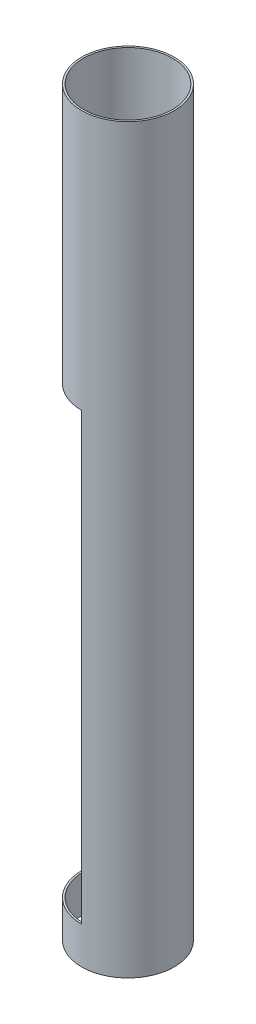
ISO-10303-21;
HEADER;
FILE_DESCRIPTION(('STEP AP214'),'2;1');
FILE_NAME('part.step','',(''),(''),'','','');
FILE_SCHEMA(('AUTOMOTIVE_DESIGN { 1 0 10303 214 1 1 1 1 }'));
ENDSEC;
DATA;
#1=APPLICATION_CONTEXT('core data for automotive mechanical design processes');
#2=APPLICATION_PROTOCOL_DEFINITION('international standard','automotive_design',2000,#1);
#3=PRODUCT_CONTEXT('',#1,'mechanical');
#4=PRODUCT('Part','Part','',(#3));
#5=PRODUCT_RELATED_PRODUCT_CATEGORY('part','',(#4));
#6=PRODUCT_DEFINITION_FORMATION('','',#4);
#7=PRODUCT_DEFINITION_CONTEXT('part definition',#1,'design');
#8=PRODUCT_DEFINITION('design','',#6,#7);
#9=PRODUCT_DEFINITION_SHAPE('','',#8);
#10=(LENGTH_UNIT() NAMED_UNIT(*) SI_UNIT(.MILLI.,.METRE.));
#11=(NAMED_UNIT(*) PLANE_ANGLE_UNIT() SI_UNIT($,.RADIAN.));
#12=(NAMED_UNIT(*) SI_UNIT($,.STERADIAN.) SOLID_ANGLE_UNIT());
#13=UNCERTAINTY_MEASURE_WITH_UNIT(LENGTH_MEASURE(1.E-05),#10,'distance_accuracy_value','');
#14=(GEOMETRIC_REPRESENTATION_CONTEXT(3) GLOBAL_UNCERTAINTY_ASSIGNED_CONTEXT((#13)) GLOBAL_UNIT_ASSIGNED_CONTEXT((#10,
#11,#12)) REPRESENTATION_CONTEXT('',''));
#15=CARTESIAN_POINT('',(0.,0.,0.));
#16=DIRECTION('',(0.,0.,1.));
#17=DIRECTION('',(1.,0.,0.));
#18=AXIS2_PLACEMENT_3D('',#15,#16,#17);
#19=CARTESIAN_POINT('',(0.,200.,0.));
#20=DIRECTION('',(0.,-1.,0.));
#21=DIRECTION('',(0.,0.,-1.));
#22=AXIS2_PLACEMENT_3D('',#19,#20,#21);
#23=CYLINDRICAL_SURFACE('',#22,25.);
#24=CARTESIAN_POINT('',(0.,-200.,0.));
#25=DIRECTION('',(0.,1.,0.));
#26=DIRECTION('',(0.,0.,1.));
#27=AXIS2_PLACEMENT_3D('',#24,#25,#26);
#28=CIRCLE('',#27,25.);
#29=CARTESIAN_POINT('',(0.,-200.,25.));
#30=VERTEX_POINT('',#29);
#31=EDGE_CURVE('E96',#30,#30,#28,.T.);
#32=ORIENTED_EDGE('',*,*,#31,.T.);
#33=EDGE_LOOP('',(#32));
#34=FACE_BOUND('',#33,.T.);
#35=CARTESIAN_POINT('',(0.,200.,0.));
#36=DIRECTION('',(0.,1.,0.));
#37=DIRECTION('',(0.,0.,1.));
#38=AXIS2_PLACEMENT_3D('',#35,#36,#37);
#39=CIRCLE('',#38,25.);
#40=CARTESIAN_POINT('',(0.,200.,25.));
#41=VERTEX_POINT('',#40);
#42=EDGE_CURVE('E101',#41,#41,#39,.T.);
#43=ORIENTED_EDGE('',*,*,#42,.F.);
#44=EDGE_LOOP('',(#43));
#45=FACE_BOUND('',#44,.T.);
#46=CARTESIAN_POINT('',(0.,60.,0.));
#47=DIRECTION('',(0.,-1.,0.));
#48=DIRECTION('',(0.,0.,-1.));
#49=AXIS2_PLACEMENT_3D('',#46,#47,#48);
#50=CIRCLE('',#49,25.);
#51=CARTESIAN_POINT('',(0.,60.,25.));
#52=VERTEX_POINT('',#51);
#53=CARTESIAN_POINT('',(0.,60.,-25.));
#54=VERTEX_POINT('',#53);
#55=EDGE_CURVE('E74',#52,#54,#50,.T.);
#56=ORIENTED_EDGE('',*,*,#55,.F.);
#57=DIRECTION('',(0.,-1.,0.));
#58=VECTOR('',#57,1.);
#59=CARTESIAN_POINT('',(0.,200.,25.));
#60=LINE('',#59,#58);
#61=CARTESIAN_POINT('',(0.,-180.,25.));
#62=VERTEX_POINT('',#61);
#63=EDGE_CURVE('E80',#62,#52,#60,.F.);
#64=ORIENTED_EDGE('',*,*,#63,.F.);
#65=CARTESIAN_POINT('',(0.,-180.,0.));
#66=DIRECTION('',(0.,-1.,0.));
#67=DIRECTION('',(0.,0.,-1.));
#68=AXIS2_PLACEMENT_3D('',#65,#66,#67);
#69=CIRCLE('',#68,25.);
#70=CARTESIAN_POINT('',(0.,-180.,-25.));
#71=VERTEX_POINT('',#70);
#72=EDGE_CURVE('E69',#62,#71,#69,.T.);
#73=ORIENTED_EDGE('',*,*,#72,.T.);
#74=DIRECTION('',(0.,-1.,0.));
#75=VECTOR('',#74,1.);
#76=CARTESIAN_POINT('',(0.,200.,-25.));
#77=LINE('',#76,#75);
#78=EDGE_CURVE('E87',#54,#71,#77,.T.);
#79=ORIENTED_EDGE('',*,*,#78,.F.);
#80=EDGE_LOOP('',(#56,#64,#73,#79));
#81=FACE_BOUND('',#80,.T.);
#82=ADVANCED_FACE('F33',(#34,#45,#81),#23,.T.);
#83=CARTESIAN_POINT('',(0.,-200.,0.));
#84=DIRECTION('',(0.,1.,0.));
#85=DIRECTION('',(0.,0.,1.));
#86=AXIS2_PLACEMENT_3D('',#83,#84,#85);
#87=CYLINDRICAL_SURFACE('',#86,24.);
#88=CARTESIAN_POINT('',(0.,200.,0.));
#89=DIRECTION('',(0.,1.,0.));
#90=DIRECTION('',(0.,0.,1.));
#91=AXIS2_PLACEMENT_3D('',#88,#89,#90);
#92=CIRCLE('',#91,24.);
#93=CARTESIAN_POINT('',(0.,200.,24.));
#94=VERTEX_POINT('',#93);
#95=EDGE_CURVE('E89',#94,#94,#92,.T.);
#96=ORIENTED_EDGE('',*,*,#95,.T.);
#97=EDGE_LOOP('',(#96));
#98=FACE_BOUND('',#97,.T.);
#99=CARTESIAN_POINT('',(0.,-200.,0.));
#100=DIRECTION('',(0.,1.,0.));
#101=DIRECTION('',(0.,0.,1.));
#102=AXIS2_PLACEMENT_3D('',#99,#100,#101);
#103=CIRCLE('',#102,24.);
#104=CARTESIAN_POINT('',(0.,-200.,24.));
#105=VERTEX_POINT('',#104);
#106=EDGE_CURVE('E93',#105,#105,#103,.T.);
#107=ORIENTED_EDGE('',*,*,#106,.F.);
#108=EDGE_LOOP('',(#107));
#109=FACE_BOUND('',#108,.T.);
#110=CARTESIAN_POINT('',(0.,60.,0.));
#111=DIRECTION('',(0.,-1.,0.));
#112=DIRECTION('',(0.,0.,-1.));
#113=AXIS2_PLACEMENT_3D('',#110,#111,#112);
#114=CIRCLE('',#113,24.);
#115=CARTESIAN_POINT('',(0.,60.,-24.));
#116=VERTEX_POINT('',#115);
#117=CARTESIAN_POINT('',(0.,60.,24.));
#118=VERTEX_POINT('',#117);
#119=EDGE_CURVE('E11',#116,#118,#114,.F.);
#120=ORIENTED_EDGE('',*,*,#119,.F.);
#121=DIRECTION('',(0.,1.,0.));
#122=VECTOR('',#121,1.);
#123=CARTESIAN_POINT('',(0.,-200.,-24.));
#124=LINE('',#123,#122);
#125=CARTESIAN_POINT('',(0.,-180.,-24.));
#126=VERTEX_POINT('',#125);
#127=EDGE_CURVE('E106',#126,#116,#124,.T.);
#128=ORIENTED_EDGE('',*,*,#127,.F.);
#129=CARTESIAN_POINT('',(0.,-180.,0.));
#130=DIRECTION('',(0.,-1.,0.));
#131=DIRECTION('',(0.,0.,-1.));
#132=AXIS2_PLACEMENT_3D('',#129,#130,#131);
#133=CIRCLE('',#132,24.);
#134=CARTESIAN_POINT('',(0.,-180.,24.));
#135=VERTEX_POINT('',#134);
#136=EDGE_CURVE('E104',#126,#135,#133,.F.);
#137=ORIENTED_EDGE('',*,*,#136,.T.);
#138=DIRECTION('',(0.,1.,0.));
#139=VECTOR('',#138,1.);
#140=CARTESIAN_POINT('',(0.,-200.,24.));
#141=LINE('',#140,#139);
#142=EDGE_CURVE('E40',#118,#135,#141,.F.);
#143=ORIENTED_EDGE('',*,*,#142,.F.);
#144=EDGE_LOOP('',(#120,#128,#137,#143));
#145=FACE_BOUND('',#144,.T.);
#146=ADVANCED_FACE('F117',(#98,#109,#145),#87,.F.);
#147=CARTESIAN_POINT('',(0.,200.,0.));
#148=DIRECTION('',(0.,1.,0.));
#149=DIRECTION('',(0.,0.,1.));
#150=AXIS2_PLACEMENT_3D('',#147,#148,#149);
#151=PLANE('',#150);
#152=ORIENTED_EDGE('',*,*,#95,.F.);
#153=EDGE_LOOP('',(#152));
#154=FACE_BOUND('',#153,.T.);
#155=ORIENTED_EDGE('',*,*,#42,.T.);
#156=EDGE_LOOP('',(#155));
#157=FACE_BOUND('',#156,.T.);
#158=ADVANCED_FACE('F119',(#154,#157),#151,.T.);
#159=CARTESIAN_POINT('',(0.,-200.,0.));
#160=DIRECTION('',(0.,1.,0.));
#161=DIRECTION('',(0.,0.,1.));
#162=AXIS2_PLACEMENT_3D('',#159,#160,#161);
#163=PLANE('',#162);
#164=ORIENTED_EDGE('',*,*,#106,.T.);
#165=EDGE_LOOP('',(#164));
#166=FACE_BOUND('',#165,.T.);
#167=ORIENTED_EDGE('',*,*,#31,.F.);
#168=EDGE_LOOP('',(#167));
#169=FACE_BOUND('',#168,.T.);
#170=ADVANCED_FACE('F126',(#166,#169),#163,.F.);
#171=CARTESIAN_POINT('',(0.,60.,-300.));
#172=DIRECTION('',(-1.,0.,0.));
#173=DIRECTION('',(0.,0.,1.));
#174=AXIS2_PLACEMENT_3D('',#171,#172,#173);
#175=PLANE('',#174);
#176=ORIENTED_EDGE('',*,*,#78,.T.);
#177=DIRECTION('',(0.,0.,-1.));
#178=VECTOR('',#177,1.);
#179=CARTESIAN_POINT('',(0.,-180.,-300.));
#180=LINE('',#179,#178);
#181=EDGE_CURVE('E47',#126,#71,#180,.T.);
#182=ORIENTED_EDGE('',*,*,#181,.F.);
#183=ORIENTED_EDGE('',*,*,#127,.T.);
#184=DIRECTION('',(0.,0.,-1.));
#185=VECTOR('',#184,1.);
#186=CARTESIAN_POINT('',(0.,60.,-300.));
#187=LINE('',#186,#185);
#188=EDGE_CURVE('E84',#116,#54,#187,.T.);
#189=ORIENTED_EDGE('',*,*,#188,.T.);
#190=EDGE_LOOP('',(#176,#182,#183,#189));
#191=FACE_BOUND('',#190,.T.);
#192=ADVANCED_FACE('F111',(#191),#175,.T.);
#193=ORIENTED_EDGE('',*,*,#63,.T.);
#194=EDGE_CURVE('E75',#52,#118,#187,.T.);
#195=ORIENTED_EDGE('',*,*,#194,.T.);
#196=ORIENTED_EDGE('',*,*,#142,.T.);
#197=EDGE_CURVE('E52',#62,#135,#180,.T.);
#198=ORIENTED_EDGE('',*,*,#197,.F.);
#199=EDGE_LOOP('',(#193,#195,#196,#198));
#200=FACE_BOUND('',#199,.T.);
#201=ADVANCED_FACE('F78',(#200),#175,.T.);
#202=CARTESIAN_POINT('',(0.,60.,0.));
#203=DIRECTION('',(0.,-1.,0.));
#204=DIRECTION('',(0.,0.,-1.));
#205=AXIS2_PLACEMENT_3D('',#202,#203,#204);
#206=PLANE('',#205);
#207=ORIENTED_EDGE('',*,*,#55,.T.);
#208=ORIENTED_EDGE('',*,*,#188,.F.);
#209=ORIENTED_EDGE('',*,*,#119,.T.);
#210=ORIENTED_EDGE('',*,*,#194,.F.);
#211=EDGE_LOOP('',(#207,#208,#209,#210));
#212=FACE_BOUND('',#211,.T.);
#213=ADVANCED_FACE('F115',(#212),#206,.T.);
#214=CARTESIAN_POINT('',(0.,-180.,0.));
#215=DIRECTION('',(0.,-1.,0.));
#216=DIRECTION('',(0.,0.,-1.));
#217=AXIS2_PLACEMENT_3D('',#214,#215,#216);
#218=PLANE('',#217);
#219=ORIENTED_EDGE('',*,*,#197,.T.);
#220=ORIENTED_EDGE('',*,*,#136,.F.);
#221=ORIENTED_EDGE('',*,*,#181,.T.);
#222=ORIENTED_EDGE('',*,*,#72,.F.);
#223=EDGE_LOOP('',(#219,#220,#221,#222));
#224=FACE_BOUND('',#223,.T.);
#225=ADVANCED_FACE('F70',(#224),#218,.F.);
#226=CLOSED_SHELL('',(#82,#146,#158,#170,#192,#201,#213,#225));
#227=MANIFOLD_SOLID_BREP('B2',#226);
#228=ADVANCED_BREP_SHAPE_REPRESENTATION('',(#18,#227),#14);
#229=SHAPE_DEFINITION_REPRESENTATION(#9,#228);
ENDSEC;
END-ISO-10303-21;
